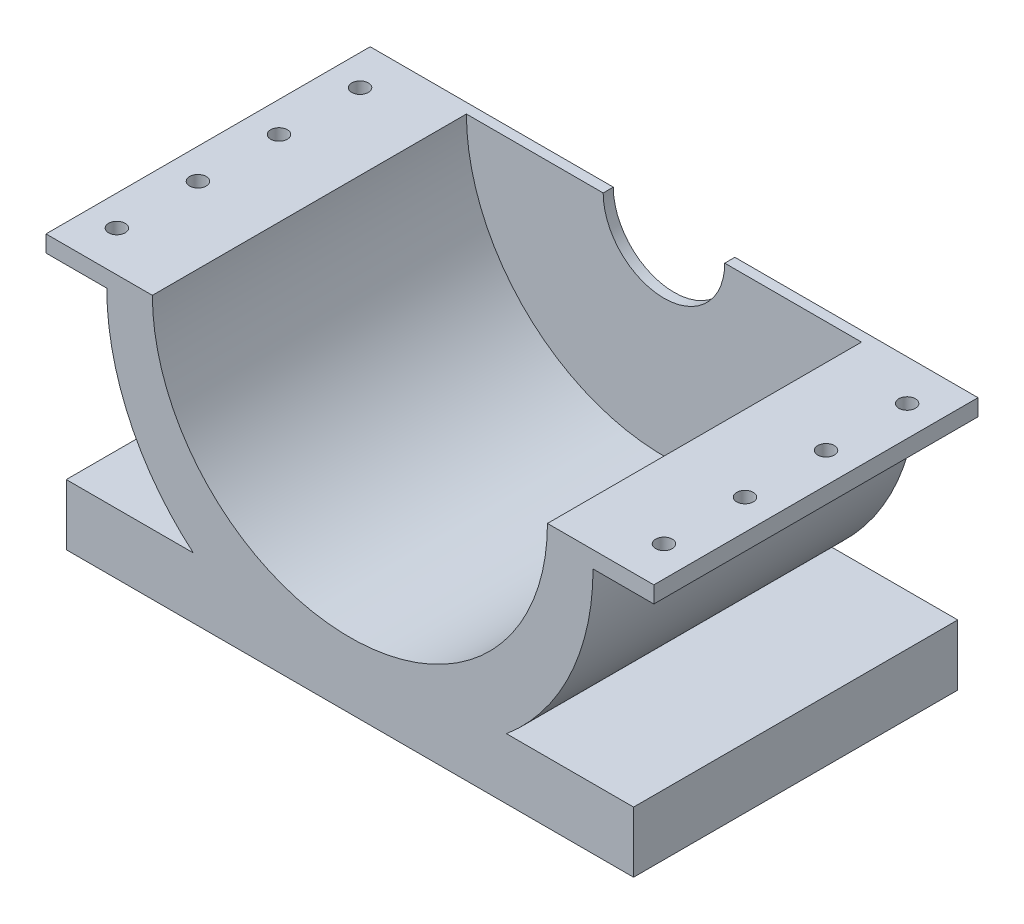
ISO-10303-21;
HEADER;
FILE_DESCRIPTION(('STEP AP214'),'2;1');
FILE_NAME('part.step','',(''),(''),'','','');
FILE_SCHEMA(('AUTOMOTIVE_DESIGN { 1 0 10303 214 1 1 1 1 }'));
ENDSEC;
DATA;
#1=APPLICATION_CONTEXT('core data for automotive mechanical design processes');
#2=APPLICATION_PROTOCOL_DEFINITION('international standard','automotive_design',2000,#1);
#3=PRODUCT_CONTEXT('',#1,'mechanical');
#4=PRODUCT('Part','Part','',(#3));
#5=PRODUCT_RELATED_PRODUCT_CATEGORY('part','',(#4));
#6=PRODUCT_DEFINITION_FORMATION('','',#4);
#7=PRODUCT_DEFINITION_CONTEXT('part definition',#1,'design');
#8=PRODUCT_DEFINITION('design','',#6,#7);
#9=PRODUCT_DEFINITION_SHAPE('','',#8);
#10=(LENGTH_UNIT() NAMED_UNIT(*) SI_UNIT(.MILLI.,.METRE.));
#11=(NAMED_UNIT(*) PLANE_ANGLE_UNIT() SI_UNIT($,.RADIAN.));
#12=(NAMED_UNIT(*) SI_UNIT($,.STERADIAN.) SOLID_ANGLE_UNIT());
#13=UNCERTAINTY_MEASURE_WITH_UNIT(LENGTH_MEASURE(1.E-05),#10,'distance_accuracy_value','');
#14=(GEOMETRIC_REPRESENTATION_CONTEXT(3) GLOBAL_UNCERTAINTY_ASSIGNED_CONTEXT((#13)) GLOBAL_UNIT_ASSIGNED_CONTEXT((#10,
#11,#12)) REPRESENTATION_CONTEXT('',''));
#15=CARTESIAN_POINT('',(0.,0.,0.));
#16=DIRECTION('',(0.,0.,1.));
#17=DIRECTION('',(1.,0.,0.));
#18=AXIS2_PLACEMENT_3D('',#15,#16,#17);
#19=CARTESIAN_POINT('',(7.5,0.41,4.));
#20=DIRECTION('',(0.,-1.,0.));
#21=DIRECTION('',(1.,0.,0.));
#22=AXIS2_PLACEMENT_3D('',#19,#20,#21);
#23=PLANE('',#22);
#24=CARTESIAN_POINT('',(-6.75,0.41,-1.));
#25=DIRECTION('',(0.,-1.,0.));
#26=DIRECTION('',(1.,0.,0.));
#27=AXIS2_PLACEMENT_3D('',#24,#25,#26);
#28=CIRCLE('',#27,0.205000000000001);
#29=CARTESIAN_POINT('',(-6.545,0.41,-1.));
#30=VERTEX_POINT('',#29);
#31=EDGE_CURVE('E233',#30,#30,#28,.T.);
#32=ORIENTED_EDGE('',*,*,#31,.T.);
#33=EDGE_LOOP('',(#32));
#34=FACE_BOUND('',#33,.T.);
#35=CARTESIAN_POINT('',(-6.75,0.41,1.));
#36=DIRECTION('',(0.,-1.,0.));
#37=DIRECTION('',(1.,0.,0.));
#38=AXIS2_PLACEMENT_3D('',#35,#36,#37);
#39=CIRCLE('',#38,0.205000000000001);
#40=CARTESIAN_POINT('',(-6.545,0.41,1.));
#41=VERTEX_POINT('',#40);
#42=EDGE_CURVE('E573',#41,#41,#39,.T.);
#43=ORIENTED_EDGE('',*,*,#42,.T.);
#44=EDGE_LOOP('',(#43));
#45=FACE_BOUND('',#44,.T.);
#46=CARTESIAN_POINT('',(-6.75,0.41,3.));
#47=DIRECTION('',(0.,-1.,0.));
#48=DIRECTION('',(1.,0.,0.));
#49=AXIS2_PLACEMENT_3D('',#46,#47,#48);
#50=CIRCLE('',#49,0.205000000000001);
#51=CARTESIAN_POINT('',(-6.545,0.41,3.));
#52=VERTEX_POINT('',#51);
#53=EDGE_CURVE('E246',#52,#52,#50,.T.);
#54=ORIENTED_EDGE('',*,*,#53,.T.);
#55=EDGE_LOOP('',(#54));
#56=FACE_BOUND('',#55,.T.);
#57=CARTESIAN_POINT('',(-6.75,0.41,-3.));
#58=DIRECTION('',(0.,-1.,0.));
#59=DIRECTION('',(1.,0.,0.));
#60=AXIS2_PLACEMENT_3D('',#57,#58,#59);
#61=CIRCLE('',#60,0.205000000000001);
#62=CARTESIAN_POINT('',(-6.545,0.41,-3.));
#63=VERTEX_POINT('',#62);
#64=EDGE_CURVE('E229',#63,#63,#61,.T.);
#65=ORIENTED_EDGE('',*,*,#64,.T.);
#66=EDGE_LOOP('',(#65));
#67=FACE_BOUND('',#66,.T.);
#68=DIRECTION('',(-1.,0.,0.));
#69=VECTOR('',#68,1.);
#70=CARTESIAN_POINT('',(-4.875,0.409999999999999,-3.75));
#71=LINE('',#70,#69);
#72=CARTESIAN_POINT('',(-1.5,0.409999999999999,-3.75));
#73=VERTEX_POINT('',#72);
#74=CARTESIAN_POINT('',(-4.875,0.409999999999999,-3.75));
#75=VERTEX_POINT('',#74);
#76=EDGE_CURVE('E161',#73,#75,#71,.T.);
#77=ORIENTED_EDGE('',*,*,#76,.F.);
#78=DIRECTION('',(0.,0.,-1.));
#79=VECTOR('',#78,1.);
#80=CARTESIAN_POINT('',(-1.5,0.409999999999999,3.75));
#81=LINE('',#80,#79);
#82=CARTESIAN_POINT('',(-1.5,0.409999999999999,-4.));
#83=VERTEX_POINT('',#82);
#84=EDGE_CURVE('E49',#73,#83,#81,.T.);
#85=ORIENTED_EDGE('',*,*,#84,.T.);
#86=DIRECTION('',(-1.,0.,0.));
#87=VECTOR('',#86,1.);
#88=CARTESIAN_POINT('',(7.5,0.41,-4.));
#89=LINE('',#88,#87);
#90=CARTESIAN_POINT('',(-7.5,0.409999999999998,-4.));
#91=VERTEX_POINT('',#90);
#92=EDGE_CURVE('E159',#83,#91,#89,.T.);
#93=ORIENTED_EDGE('',*,*,#92,.T.);
#94=DIRECTION('',(0.,0.,-1.));
#95=VECTOR('',#94,1.);
#96=CARTESIAN_POINT('',(-7.5,0.409999999999998,4.));
#97=LINE('',#96,#95);
#98=CARTESIAN_POINT('',(-7.5,0.409999999999998,4.));
#99=VERTEX_POINT('',#98);
#100=EDGE_CURVE('E215',#99,#91,#97,.T.);
#101=ORIENTED_EDGE('',*,*,#100,.F.);
#102=DIRECTION('',(-1.,0.,0.));
#103=VECTOR('',#102,1.);
#104=CARTESIAN_POINT('',(7.5,0.41,4.));
#105=LINE('',#104,#103);
#106=CARTESIAN_POINT('',(-4.875,0.409999999999998,4.));
#107=VERTEX_POINT('',#106);
#108=EDGE_CURVE('E290',#107,#99,#105,.T.);
#109=ORIENTED_EDGE('',*,*,#108,.F.);
#110=DIRECTION('',(0.,0.,1.));
#111=VECTOR('',#110,1.);
#112=CARTESIAN_POINT('',(-4.875,0.409999999999999,-3.75));
#113=LINE('',#112,#111);
#114=EDGE_CURVE('E57',#75,#107,#113,.T.);
#115=ORIENTED_EDGE('',*,*,#114,.F.);
#116=EDGE_LOOP('',(#77,#85,#93,#101,#109,#115));
#117=FACE_BOUND('',#116,.T.);
#118=ADVANCED_FACE('F33',(#34,#45,#56,#67,#117),#23,.F.);
#119=CARTESIAN_POINT('',(0.,0.,4.));
#120=DIRECTION('',(0.,0.,-1.));
#121=DIRECTION('',(-1.,0.,0.));
#122=AXIS2_PLACEMENT_3D('',#119,#120,#121);
#123=CYLINDRICAL_SURFACE('',#122,6.);
#124=CARTESIAN_POINT('',(0.,0.,-4.));
#125=DIRECTION('',(0.,0.,1.));
#126=DIRECTION('',(1.,0.,0.));
#127=AXIS2_PLACEMENT_3D('',#124,#125,#126);
#128=CIRCLE('',#127,6.);
#129=CARTESIAN_POINT('',(3.8641816727478,-4.59,-4.));
#130=VERTEX_POINT('',#129);
#131=CARTESIAN_POINT('',(6.,0.,-4.));
#132=VERTEX_POINT('',#131);
#133=EDGE_CURVE('E281',#130,#132,#128,.T.);
#134=ORIENTED_EDGE('',*,*,#133,.T.);
#135=DIRECTION('',(0.,0.,-1.));
#136=VECTOR('',#135,1.);
#137=CARTESIAN_POINT('',(6.,0.,4.));
#138=LINE('',#137,#136);
#139=CARTESIAN_POINT('',(6.,0.,4.));
#140=VERTEX_POINT('',#139);
#141=EDGE_CURVE('E42',#140,#132,#138,.T.);
#142=ORIENTED_EDGE('',*,*,#141,.F.);
#143=CARTESIAN_POINT('',(0.,0.,4.));
#144=DIRECTION('',(0.,0.,1.));
#145=DIRECTION('',(1.,0.,0.));
#146=AXIS2_PLACEMENT_3D('',#143,#144,#145);
#147=CIRCLE('',#146,6.);
#148=CARTESIAN_POINT('',(3.8641816727478,-4.59,4.));
#149=VERTEX_POINT('',#148);
#150=EDGE_CURVE('E189',#149,#140,#147,.T.);
#151=ORIENTED_EDGE('',*,*,#150,.F.);
#152=DIRECTION('',(0.,0.,-1.));
#153=VECTOR('',#152,1.);
#154=CARTESIAN_POINT('',(3.8641816727478,-4.59,4.));
#155=LINE('',#154,#153);
#156=EDGE_CURVE('E190',#149,#130,#155,.T.);
#157=ORIENTED_EDGE('',*,*,#156,.T.);
#158=EDGE_LOOP('',(#134,#142,#151,#157));
#159=FACE_BOUND('',#158,.T.);
#160=ADVANCED_FACE('F35',(#159),#123,.T.);
#161=CARTESIAN_POINT('',(7.5,0.,4.));
#162=DIRECTION('',(0.,1.,0.));
#163=DIRECTION('',(-1.,0.,0.));
#164=AXIS2_PLACEMENT_3D('',#161,#162,#163);
#165=PLANE('',#164);
#166=CARTESIAN_POINT('',(6.75,0.,-1.));
#167=DIRECTION('',(0.,1.,0.));
#168=DIRECTION('',(-1.,0.,0.));
#169=AXIS2_PLACEMENT_3D('',#166,#167,#168);
#170=CIRCLE('',#169,0.205000000000001);
#171=CARTESIAN_POINT('',(6.545,0.,-1.));
#172=VERTEX_POINT('',#171);
#173=EDGE_CURVE('E262',#172,#172,#170,.T.);
#174=ORIENTED_EDGE('',*,*,#173,.T.);
#175=EDGE_LOOP('',(#174));
#176=FACE_BOUND('',#175,.T.);
#177=CARTESIAN_POINT('',(6.75,0.,1.));
#178=DIRECTION('',(0.,1.,0.));
#179=DIRECTION('',(-1.,0.,0.));
#180=AXIS2_PLACEMENT_3D('',#177,#178,#179);
#181=CIRCLE('',#180,0.205000000000001);
#182=CARTESIAN_POINT('',(6.545,0.,1.));
#183=VERTEX_POINT('',#182);
#184=EDGE_CURVE('E259',#183,#183,#181,.T.);
#185=ORIENTED_EDGE('',*,*,#184,.T.);
#186=EDGE_LOOP('',(#185));
#187=FACE_BOUND('',#186,.T.);
#188=CARTESIAN_POINT('',(6.75,0.,3.));
#189=DIRECTION('',(0.,1.,0.));
#190=DIRECTION('',(-1.,0.,0.));
#191=AXIS2_PLACEMENT_3D('',#188,#189,#190);
#192=CIRCLE('',#191,0.205000000000001);
#193=CARTESIAN_POINT('',(6.545,0.,3.));
#194=VERTEX_POINT('',#193);
#195=EDGE_CURVE('E251',#194,#194,#192,.T.);
#196=ORIENTED_EDGE('',*,*,#195,.T.);
#197=EDGE_LOOP('',(#196));
#198=FACE_BOUND('',#197,.T.);
#199=CARTESIAN_POINT('',(6.75,0.,-3.));
#200=DIRECTION('',(0.,1.,0.));
#201=DIRECTION('',(-1.,0.,0.));
#202=AXIS2_PLACEMENT_3D('',#199,#200,#201);
#203=CIRCLE('',#202,0.205000000000001);
#204=CARTESIAN_POINT('',(6.545,0.,-3.));
#205=VERTEX_POINT('',#204);
#206=EDGE_CURVE('E154',#205,#205,#203,.T.);
#207=ORIENTED_EDGE('',*,*,#206,.T.);
#208=EDGE_LOOP('',(#207));
#209=FACE_BOUND('',#208,.T.);
#210=DIRECTION('',(1.,0.,0.));
#211=VECTOR('',#210,1.);
#212=CARTESIAN_POINT('',(7.5,0.,-4.));
#213=LINE('',#212,#211);
#214=CARTESIAN_POINT('',(7.5,0.,-4.));
#215=VERTEX_POINT('',#214);
#216=EDGE_CURVE('E170',#132,#215,#213,.T.);
#217=ORIENTED_EDGE('',*,*,#216,.T.);
#218=DIRECTION('',(0.,0.,-1.));
#219=VECTOR('',#218,1.);
#220=CARTESIAN_POINT('',(7.5,0.,4.));
#221=LINE('',#220,#219);
#222=CARTESIAN_POINT('',(7.5,0.,4.));
#223=VERTEX_POINT('',#222);
#224=EDGE_CURVE('E220',#223,#215,#221,.T.);
#225=ORIENTED_EDGE('',*,*,#224,.F.);
#226=DIRECTION('',(1.,0.,0.));
#227=VECTOR('',#226,1.);
#228=CARTESIAN_POINT('',(7.5,0.,4.));
#229=LINE('',#228,#227);
#230=EDGE_CURVE('E286',#140,#223,#229,.T.);
#231=ORIENTED_EDGE('',*,*,#230,.F.);
#232=ORIENTED_EDGE('',*,*,#141,.T.);
#233=EDGE_LOOP('',(#217,#225,#231,#232));
#234=FACE_BOUND('',#233,.T.);
#235=ADVANCED_FACE('F312',(#176,#187,#198,#209,#234),#165,.F.);
#236=CARTESIAN_POINT('',(7.5,0.41,4.));
#237=DIRECTION('',(-1.,0.,0.));
#238=DIRECTION('',(0.,0.,1.));
#239=AXIS2_PLACEMENT_3D('',#236,#237,#238);
#240=PLANE('',#239);
#241=DIRECTION('',(0.,1.,0.));
#242=VECTOR('',#241,1.);
#243=CARTESIAN_POINT('',(7.5,0.41,-4.));
#244=LINE('',#243,#242);
#245=CARTESIAN_POINT('',(7.5,0.41,-4.));
#246=VERTEX_POINT('',#245);
#247=EDGE_CURVE('E168',#215,#246,#244,.T.);
#248=ORIENTED_EDGE('',*,*,#247,.T.);
#249=DIRECTION('',(0.,0.,-1.));
#250=VECTOR('',#249,1.);
#251=CARTESIAN_POINT('',(7.5,0.41,4.));
#252=LINE('',#251,#250);
#253=CARTESIAN_POINT('',(7.5,0.41,4.));
#254=VERTEX_POINT('',#253);
#255=EDGE_CURVE('E217',#254,#246,#252,.T.);
#256=ORIENTED_EDGE('',*,*,#255,.F.);
#257=DIRECTION('',(0.,1.,0.));
#258=VECTOR('',#257,1.);
#259=CARTESIAN_POINT('',(7.5,0.41,4.));
#260=LINE('',#259,#258);
#261=EDGE_CURVE('E288',#223,#254,#260,.T.);
#262=ORIENTED_EDGE('',*,*,#261,.F.);
#263=ORIENTED_EDGE('',*,*,#224,.T.);
#264=EDGE_LOOP('',(#248,#256,#262,#263));
#265=FACE_BOUND('',#264,.T.);
#266=ADVANCED_FACE('F318',(#265),#240,.F.);
#267=CARTESIAN_POINT('',(6.75,0.41,-1.));
#268=DIRECTION('',(0.,1.,0.));
#269=DIRECTION('',(-1.,0.,0.));
#270=AXIS2_PLACEMENT_3D('',#267,#268,#269);
#271=CIRCLE('',#270,0.205000000000001);
#272=CARTESIAN_POINT('',(6.545,0.41,-1.));
#273=VERTEX_POINT('',#272);
#274=EDGE_CURVE('E248',#273,#273,#271,.T.);
#275=ORIENTED_EDGE('',*,*,#274,.F.);
#276=EDGE_LOOP('',(#275));
#277=FACE_BOUND('',#276,.T.);
#278=CARTESIAN_POINT('',(6.75,0.41,1.));
#279=DIRECTION('',(0.,1.,0.));
#280=DIRECTION('',(-1.,0.,0.));
#281=AXIS2_PLACEMENT_3D('',#278,#279,#280);
#282=CIRCLE('',#281,0.205000000000001);
#283=CARTESIAN_POINT('',(6.545,0.41,1.));
#284=VERTEX_POINT('',#283);
#285=EDGE_CURVE('E252',#284,#284,#282,.T.);
#286=ORIENTED_EDGE('',*,*,#285,.F.);
#287=EDGE_LOOP('',(#286));
#288=FACE_BOUND('',#287,.T.);
#289=CARTESIAN_POINT('',(6.75,0.41,3.));
#290=DIRECTION('',(0.,1.,0.));
#291=DIRECTION('',(-1.,0.,0.));
#292=AXIS2_PLACEMENT_3D('',#289,#290,#291);
#293=CIRCLE('',#292,0.205000000000001);
#294=CARTESIAN_POINT('',(6.545,0.41,3.));
#295=VERTEX_POINT('',#294);
#296=EDGE_CURVE('E228',#295,#295,#293,.T.);
#297=ORIENTED_EDGE('',*,*,#296,.F.);
#298=EDGE_LOOP('',(#297));
#299=FACE_BOUND('',#298,.T.);
#300=CARTESIAN_POINT('',(6.75,0.41,-3.));
#301=DIRECTION('',(0.,1.,0.));
#302=DIRECTION('',(-1.,0.,0.));
#303=AXIS2_PLACEMENT_3D('',#300,#301,#302);
#304=CIRCLE('',#303,0.205000000000001);
#305=CARTESIAN_POINT('',(6.545,0.41,-3.));
#306=VERTEX_POINT('',#305);
#307=EDGE_CURVE('E265',#306,#306,#304,.T.);
#308=ORIENTED_EDGE('',*,*,#307,.F.);
#309=EDGE_LOOP('',(#308));
#310=FACE_BOUND('',#309,.T.);
#311=CARTESIAN_POINT('',(1.5,0.409999999999999,-4.));
#312=VERTEX_POINT('',#311);
#313=EDGE_CURVE('E167',#246,#312,#89,.T.);
#314=ORIENTED_EDGE('',*,*,#313,.T.);
#315=DIRECTION('',(0.,0.,-1.));
#316=VECTOR('',#315,1.);
#317=CARTESIAN_POINT('',(1.5,0.409999999999999,3.75));
#318=LINE('',#317,#316);
#319=CARTESIAN_POINT('',(1.5,0.409999999999999,-3.75));
#320=VERTEX_POINT('',#319);
#321=EDGE_CURVE('E149',#320,#312,#318,.T.);
#322=ORIENTED_EDGE('',*,*,#321,.F.);
#323=CARTESIAN_POINT('',(4.875,0.409999999999999,-3.75));
#324=VERTEX_POINT('',#323);
#325=EDGE_CURVE('E275',#324,#320,#71,.T.);
#326=ORIENTED_EDGE('',*,*,#325,.F.);
#327=DIRECTION('',(0.,0.,1.));
#328=VECTOR('',#327,1.);
#329=CARTESIAN_POINT('',(4.875,0.409999999999999,-3.75));
#330=LINE('',#329,#328);
#331=CARTESIAN_POINT('',(4.875,0.409999999999999,4.));
#332=VERTEX_POINT('',#331);
#333=EDGE_CURVE('E278',#324,#332,#330,.T.);
#334=ORIENTED_EDGE('',*,*,#333,.T.);
#335=EDGE_CURVE('E291',#254,#332,#105,.T.);
#336=ORIENTED_EDGE('',*,*,#335,.F.);
#337=ORIENTED_EDGE('',*,*,#255,.T.);
#338=EDGE_LOOP('',(#314,#322,#326,#334,#336,#337));
#339=FACE_BOUND('',#338,.T.);
#340=ADVANCED_FACE('F321',(#277,#288,#299,#310,#339),#23,.F.);
#341=CARTESIAN_POINT('',(-7.5,0.409999999999998,4.));
#342=DIRECTION('',(1.,0.,0.));
#343=DIRECTION('',(0.,1.,0.));
#344=AXIS2_PLACEMENT_3D('',#341,#342,#343);
#345=PLANE('',#344);
#346=DIRECTION('',(0.,-1.,0.));
#347=VECTOR('',#346,1.);
#348=CARTESIAN_POINT('',(-7.5,0.409999999999998,-4.));
#349=LINE('',#348,#347);
#350=CARTESIAN_POINT('',(-7.5,0.,-4.));
#351=VERTEX_POINT('',#350);
#352=EDGE_CURVE('E166',#91,#351,#349,.T.);
#353=ORIENTED_EDGE('',*,*,#352,.T.);
#354=DIRECTION('',(0.,0.,-1.));
#355=VECTOR('',#354,1.);
#356=CARTESIAN_POINT('',(-7.5,0.,4.));
#357=LINE('',#356,#355);
#358=CARTESIAN_POINT('',(-7.5,0.,4.));
#359=VERTEX_POINT('',#358);
#360=EDGE_CURVE('E212',#359,#351,#357,.T.);
#361=ORIENTED_EDGE('',*,*,#360,.F.);
#362=DIRECTION('',(0.,-1.,0.));
#363=VECTOR('',#362,1.);
#364=CARTESIAN_POINT('',(-7.5,0.409999999999998,4.));
#365=LINE('',#364,#363);
#366=EDGE_CURVE('E294',#99,#359,#365,.T.);
#367=ORIENTED_EDGE('',*,*,#366,.F.);
#368=ORIENTED_EDGE('',*,*,#100,.T.);
#369=EDGE_LOOP('',(#353,#361,#367,#368));
#370=FACE_BOUND('',#369,.T.);
#371=ADVANCED_FACE('F366',(#370),#345,.F.);
#372=CARTESIAN_POINT('',(-6.,0.,4.));
#373=DIRECTION('',(0.,1.,0.));
#374=DIRECTION('',(-1.,0.,0.));
#375=AXIS2_PLACEMENT_3D('',#372,#373,#374);
#376=PLANE('',#375);
#377=CARTESIAN_POINT('',(-6.75,0.,-1.));
#378=DIRECTION('',(0.,1.,0.));
#379=DIRECTION('',(-1.,0.,0.));
#380=AXIS2_PLACEMENT_3D('',#377,#378,#379);
#381=CIRCLE('',#380,0.205000000000001);
#382=CARTESIAN_POINT('',(-6.955,0.,-1.));
#383=VERTEX_POINT('',#382);
#384=EDGE_CURVE('E37',#383,#383,#381,.F.);
#385=ORIENTED_EDGE('',*,*,#384,.F.);
#386=EDGE_LOOP('',(#385));
#387=FACE_BOUND('',#386,.T.);
#388=CARTESIAN_POINT('',(-6.75,0.,1.));
#389=DIRECTION('',(0.,1.,0.));
#390=DIRECTION('',(-1.,0.,0.));
#391=AXIS2_PLACEMENT_3D('',#388,#389,#390);
#392=CIRCLE('',#391,0.205000000000001);
#393=CARTESIAN_POINT('',(-6.955,0.,1.));
#394=VERTEX_POINT('',#393);
#395=EDGE_CURVE('E232',#394,#394,#392,.F.);
#396=ORIENTED_EDGE('',*,*,#395,.F.);
#397=EDGE_LOOP('',(#396));
#398=FACE_BOUND('',#397,.T.);
#399=CARTESIAN_POINT('',(-6.75,0.,3.));
#400=DIRECTION('',(0.,1.,0.));
#401=DIRECTION('',(-1.,0.,0.));
#402=AXIS2_PLACEMENT_3D('',#399,#400,#401);
#403=CIRCLE('',#402,0.205000000000001);
#404=CARTESIAN_POINT('',(-6.955,0.,3.));
#405=VERTEX_POINT('',#404);
#406=EDGE_CURVE('E230',#405,#405,#403,.F.);
#407=ORIENTED_EDGE('',*,*,#406,.F.);
#408=EDGE_LOOP('',(#407));
#409=FACE_BOUND('',#408,.T.);
#410=CARTESIAN_POINT('',(-6.75,0.,-3.));
#411=DIRECTION('',(0.,1.,0.));
#412=DIRECTION('',(-1.,0.,0.));
#413=AXIS2_PLACEMENT_3D('',#410,#411,#412);
#414=CIRCLE('',#413,0.205000000000001);
#415=CARTESIAN_POINT('',(-6.955,0.,-3.));
#416=VERTEX_POINT('',#415);
#417=EDGE_CURVE('E225',#416,#416,#414,.F.);
#418=ORIENTED_EDGE('',*,*,#417,.F.);
#419=EDGE_LOOP('',(#418));
#420=FACE_BOUND('',#419,.T.);
#421=DIRECTION('',(1.,0.,0.));
#422=VECTOR('',#421,1.);
#423=CARTESIAN_POINT('',(-6.,0.,-4.));
#424=LINE('',#423,#422);
#425=CARTESIAN_POINT('',(-6.,0.,-4.));
#426=VERTEX_POINT('',#425);
#427=EDGE_CURVE('E175',#351,#426,#424,.T.);
#428=ORIENTED_EDGE('',*,*,#427,.T.);
#429=DIRECTION('',(0.,0.,-1.));
#430=VECTOR('',#429,1.);
#431=CARTESIAN_POINT('',(-6.,0.,4.));
#432=LINE('',#431,#430);
#433=CARTESIAN_POINT('',(-6.,0.,4.));
#434=VERTEX_POINT('',#433);
#435=EDGE_CURVE('E209',#434,#426,#432,.T.);
#436=ORIENTED_EDGE('',*,*,#435,.F.);
#437=DIRECTION('',(1.,0.,0.));
#438=VECTOR('',#437,1.);
#439=CARTESIAN_POINT('',(-6.,0.,4.));
#440=LINE('',#439,#438);
#441=EDGE_CURVE('E296',#359,#434,#440,.T.);
#442=ORIENTED_EDGE('',*,*,#441,.F.);
#443=ORIENTED_EDGE('',*,*,#360,.T.);
#444=EDGE_LOOP('',(#428,#436,#442,#443));
#445=FACE_BOUND('',#444,.T.);
#446=ADVANCED_FACE('F361',(#387,#398,#409,#420,#445),#376,.F.);
#447=CARTESIAN_POINT('',(0.,0.,4.));
#448=DIRECTION('',(0.,0.,-1.));
#449=DIRECTION('',(-1.,0.,0.));
#450=AXIS2_PLACEMENT_3D('',#447,#448,#449);
#451=CYLINDRICAL_SURFACE('',#450,6.);
#452=CARTESIAN_POINT('',(0.,0.,-4.));
#453=DIRECTION('',(0.,0.,1.));
#454=DIRECTION('',(1.,0.,0.));
#455=AXIS2_PLACEMENT_3D('',#452,#453,#454);
#456=CIRCLE('',#455,6.);
#457=CARTESIAN_POINT('',(-3.86418167274781,-4.59,-4.));
#458=VERTEX_POINT('',#457);
#459=EDGE_CURVE('E177',#426,#458,#456,.T.);
#460=ORIENTED_EDGE('',*,*,#459,.T.);
#461=DIRECTION('',(0.,0.,-1.));
#462=VECTOR('',#461,1.);
#463=CARTESIAN_POINT('',(-3.86418167274781,-4.59,4.));
#464=LINE('',#463,#462);
#465=CARTESIAN_POINT('',(-3.86418167274781,-4.59,4.));
#466=VERTEX_POINT('',#465);
#467=EDGE_CURVE('E206',#466,#458,#464,.T.);
#468=ORIENTED_EDGE('',*,*,#467,.F.);
#469=CARTESIAN_POINT('',(0.,0.,4.));
#470=DIRECTION('',(0.,0.,1.));
#471=DIRECTION('',(1.,0.,0.));
#472=AXIS2_PLACEMENT_3D('',#469,#470,#471);
#473=CIRCLE('',#472,6.);
#474=EDGE_CURVE('E298',#434,#466,#473,.T.);
#475=ORIENTED_EDGE('',*,*,#474,.F.);
#476=ORIENTED_EDGE('',*,*,#435,.T.);
#477=EDGE_LOOP('',(#460,#468,#475,#476));
#478=FACE_BOUND('',#477,.T.);
#479=ADVANCED_FACE('F358',(#478),#451,.T.);
#480=CARTESIAN_POINT('',(-7.,-4.59,4.));
#481=DIRECTION('',(0.,-1.,0.));
#482=DIRECTION('',(1.,0.,0.));
#483=AXIS2_PLACEMENT_3D('',#480,#481,#482);
#484=PLANE('',#483);
#485=DIRECTION('',(-1.,0.,0.));
#486=VECTOR('',#485,1.);
#487=CARTESIAN_POINT('',(-7.,-4.59,-4.));
#488=LINE('',#487,#486);
#489=CARTESIAN_POINT('',(-7.,-4.59,-4.));
#490=VERTEX_POINT('',#489);
#491=EDGE_CURVE('E179',#458,#490,#488,.T.);
#492=ORIENTED_EDGE('',*,*,#491,.T.);
#493=DIRECTION('',(0.,0.,-1.));
#494=VECTOR('',#493,1.);
#495=CARTESIAN_POINT('',(-7.,-4.59,4.));
#496=LINE('',#495,#494);
#497=CARTESIAN_POINT('',(-7.,-4.59,4.));
#498=VERTEX_POINT('',#497);
#499=EDGE_CURVE('E203',#498,#490,#496,.T.);
#500=ORIENTED_EDGE('',*,*,#499,.F.);
#501=DIRECTION('',(-1.,0.,0.));
#502=VECTOR('',#501,1.);
#503=CARTESIAN_POINT('',(-7.,-4.59,4.));
#504=LINE('',#503,#502);
#505=EDGE_CURVE('E300',#466,#498,#504,.T.);
#506=ORIENTED_EDGE('',*,*,#505,.F.);
#507=ORIENTED_EDGE('',*,*,#467,.T.);
#508=EDGE_LOOP('',(#492,#500,#506,#507));
#509=FACE_BOUND('',#508,.T.);
#510=ADVANCED_FACE('F354',(#509),#484,.F.);
#511=CARTESIAN_POINT('',(-7.,-4.59,4.));
#512=DIRECTION('',(1.,0.,0.));
#513=DIRECTION('',(0.,0.,-1.));
#514=AXIS2_PLACEMENT_3D('',#511,#512,#513);
#515=PLANE('',#514);
#516=DIRECTION('',(0.,-1.,0.));
#517=VECTOR('',#516,1.);
#518=CARTESIAN_POINT('',(-7.,-4.59,-4.));
#519=LINE('',#518,#517);
#520=CARTESIAN_POINT('',(-7.,-6.09,-4.));
#521=VERTEX_POINT('',#520);
#522=EDGE_CURVE('E181',#490,#521,#519,.T.);
#523=ORIENTED_EDGE('',*,*,#522,.T.);
#524=DIRECTION('',(0.,0.,-1.));
#525=VECTOR('',#524,1.);
#526=CARTESIAN_POINT('',(-7.,-6.09,4.));
#527=LINE('',#526,#525);
#528=CARTESIAN_POINT('',(-7.,-6.09,4.));
#529=VERTEX_POINT('',#528);
#530=EDGE_CURVE('E200',#529,#521,#527,.T.);
#531=ORIENTED_EDGE('',*,*,#530,.F.);
#532=DIRECTION('',(0.,-1.,0.));
#533=VECTOR('',#532,1.);
#534=CARTESIAN_POINT('',(-7.,-4.59,4.));
#535=LINE('',#534,#533);
#536=EDGE_CURVE('E302',#498,#529,#535,.T.);
#537=ORIENTED_EDGE('',*,*,#536,.F.);
#538=ORIENTED_EDGE('',*,*,#499,.T.);
#539=EDGE_LOOP('',(#523,#531,#537,#538));
#540=FACE_BOUND('',#539,.T.);
#541=ADVANCED_FACE('F349',(#540),#515,.F.);
#542=CARTESIAN_POINT('',(-7.,-6.09,4.));
#543=DIRECTION('',(0.,1.,0.));
#544=DIRECTION('',(0.,0.,1.));
#545=AXIS2_PLACEMENT_3D('',#542,#543,#544);
#546=PLANE('',#545);
#547=DIRECTION('',(1.,0.,0.));
#548=VECTOR('',#547,1.);
#549=CARTESIAN_POINT('',(-7.,-6.09,-4.));
#550=LINE('',#549,#548);
#551=CARTESIAN_POINT('',(7.,-6.09,-4.));
#552=VERTEX_POINT('',#551);
#553=EDGE_CURVE('E183',#521,#552,#550,.T.);
#554=ORIENTED_EDGE('',*,*,#553,.T.);
#555=DIRECTION('',(0.,0.,-1.));
#556=VECTOR('',#555,1.);
#557=CARTESIAN_POINT('',(7.,-6.09,4.));
#558=LINE('',#557,#556);
#559=CARTESIAN_POINT('',(7.,-6.09,4.));
#560=VERTEX_POINT('',#559);
#561=EDGE_CURVE('E197',#560,#552,#558,.T.);
#562=ORIENTED_EDGE('',*,*,#561,.F.);
#563=DIRECTION('',(1.,0.,0.));
#564=VECTOR('',#563,1.);
#565=CARTESIAN_POINT('',(-7.,-6.09,4.));
#566=LINE('',#565,#564);
#567=EDGE_CURVE('E304',#529,#560,#566,.T.);
#568=ORIENTED_EDGE('',*,*,#567,.F.);
#569=ORIENTED_EDGE('',*,*,#530,.T.);
#570=EDGE_LOOP('',(#554,#562,#568,#569));
#571=FACE_BOUND('',#570,.T.);
#572=ADVANCED_FACE('F343',(#571),#546,.F.);
#573=CARTESIAN_POINT('',(7.,-4.59,4.));
#574=DIRECTION('',(-1.,0.,0.));
#575=DIRECTION('',(0.,-1.,0.));
#576=AXIS2_PLACEMENT_3D('',#573,#574,#575);
#577=PLANE('',#576);
#578=DIRECTION('',(0.,1.,0.));
#579=VECTOR('',#578,1.);
#580=CARTESIAN_POINT('',(7.,-4.59,-4.));
#581=LINE('',#580,#579);
#582=CARTESIAN_POINT('',(7.,-4.59,-4.));
#583=VERTEX_POINT('',#582);
#584=EDGE_CURVE('E185',#552,#583,#581,.T.);
#585=ORIENTED_EDGE('',*,*,#584,.T.);
#586=DIRECTION('',(0.,0.,-1.));
#587=VECTOR('',#586,1.);
#588=CARTESIAN_POINT('',(7.,-4.59,4.));
#589=LINE('',#588,#587);
#590=CARTESIAN_POINT('',(7.,-4.59,4.));
#591=VERTEX_POINT('',#590);
#592=EDGE_CURVE('E193',#591,#583,#589,.T.);
#593=ORIENTED_EDGE('',*,*,#592,.F.);
#594=DIRECTION('',(0.,1.,0.));
#595=VECTOR('',#594,1.);
#596=CARTESIAN_POINT('',(7.,-4.59,4.));
#597=LINE('',#596,#595);
#598=EDGE_CURVE('E306',#560,#591,#597,.T.);
#599=ORIENTED_EDGE('',*,*,#598,.F.);
#600=ORIENTED_EDGE('',*,*,#561,.T.);
#601=EDGE_LOOP('',(#585,#593,#599,#600));
#602=FACE_BOUND('',#601,.T.);
#603=ADVANCED_FACE('F339',(#602),#577,.F.);
#604=CARTESIAN_POINT('',(3.8641816727478,-4.59,4.));
#605=DIRECTION('',(0.,-1.,0.));
#606=DIRECTION('',(1.,0.,0.));
#607=AXIS2_PLACEMENT_3D('',#604,#605,#606);
#608=PLANE('',#607);
#609=DIRECTION('',(-1.,0.,0.));
#610=VECTOR('',#609,1.);
#611=CARTESIAN_POINT('',(3.8641816727478,-4.59,-4.));
#612=LINE('',#611,#610);
#613=EDGE_CURVE('E187',#583,#130,#612,.T.);
#614=ORIENTED_EDGE('',*,*,#613,.T.);
#615=ORIENTED_EDGE('',*,*,#156,.F.);
#616=DIRECTION('',(-1.,0.,0.));
#617=VECTOR('',#616,1.);
#618=CARTESIAN_POINT('',(3.8641816727478,-4.59,4.));
#619=LINE('',#618,#617);
#620=EDGE_CURVE('E194',#591,#149,#619,.T.);
#621=ORIENTED_EDGE('',*,*,#620,.F.);
#622=ORIENTED_EDGE('',*,*,#592,.T.);
#623=EDGE_LOOP('',(#614,#615,#621,#622));
#624=FACE_BOUND('',#623,.T.);
#625=ADVANCED_FACE('F335',(#624),#608,.F.);
#626=CARTESIAN_POINT('',(0.,0.,4.));
#627=DIRECTION('',(0.,0.,1.));
#628=DIRECTION('',(1.,0.,0.));
#629=AXIS2_PLACEMENT_3D('',#626,#627,#628);
#630=PLANE('',#629);
#631=CARTESIAN_POINT('',(0.,0.409999999999999,4.));
#632=DIRECTION('',(0.,0.,1.));
#633=DIRECTION('',(1.,0.,0.));
#634=AXIS2_PLACEMENT_3D('',#631,#632,#633);
#635=CIRCLE('',#634,4.875);
#636=EDGE_CURVE('E270',#107,#332,#635,.T.);
#637=ORIENTED_EDGE('',*,*,#636,.F.);
#638=ORIENTED_EDGE('',*,*,#108,.T.);
#639=ORIENTED_EDGE('',*,*,#366,.T.);
#640=ORIENTED_EDGE('',*,*,#441,.T.);
#641=ORIENTED_EDGE('',*,*,#474,.T.);
#642=ORIENTED_EDGE('',*,*,#505,.T.);
#643=ORIENTED_EDGE('',*,*,#536,.T.);
#644=ORIENTED_EDGE('',*,*,#567,.T.);
#645=ORIENTED_EDGE('',*,*,#598,.T.);
#646=ORIENTED_EDGE('',*,*,#620,.T.);
#647=ORIENTED_EDGE('',*,*,#150,.T.);
#648=ORIENTED_EDGE('',*,*,#230,.T.);
#649=ORIENTED_EDGE('',*,*,#261,.T.);
#650=ORIENTED_EDGE('',*,*,#335,.T.);
#651=EDGE_LOOP('',(#637,#638,#639,#640,#641,#642,#643,#644,#645,#646,#647,#648,#649,#650));
#652=FACE_BOUND('',#651,.T.);
#653=ADVANCED_FACE('F325',(#652),#630,.T.);
#654=CARTESIAN_POINT('',(0.,0.,-4.));
#655=DIRECTION('',(0.,0.,1.));
#656=DIRECTION('',(1.,0.,0.));
#657=AXIS2_PLACEMENT_3D('',#654,#655,#656);
#658=PLANE('',#657);
#659=ORIENTED_EDGE('',*,*,#92,.F.);
#660=CARTESIAN_POINT('',(0.,0.409999999999999,-4.));
#661=DIRECTION('',(0.,0.,-1.));
#662=DIRECTION('',(-1.,0.,0.));
#663=AXIS2_PLACEMENT_3D('',#660,#661,#662);
#664=CIRCLE('',#663,1.5);
#665=EDGE_CURVE('E146',#312,#83,#664,.T.);
#666=ORIENTED_EDGE('',*,*,#665,.F.);
#667=ORIENTED_EDGE('',*,*,#313,.F.);
#668=ORIENTED_EDGE('',*,*,#247,.F.);
#669=ORIENTED_EDGE('',*,*,#216,.F.);
#670=ORIENTED_EDGE('',*,*,#133,.F.);
#671=ORIENTED_EDGE('',*,*,#613,.F.);
#672=ORIENTED_EDGE('',*,*,#584,.F.);
#673=ORIENTED_EDGE('',*,*,#553,.F.);
#674=ORIENTED_EDGE('',*,*,#522,.F.);
#675=ORIENTED_EDGE('',*,*,#491,.F.);
#676=ORIENTED_EDGE('',*,*,#459,.F.);
#677=ORIENTED_EDGE('',*,*,#427,.F.);
#678=ORIENTED_EDGE('',*,*,#352,.F.);
#679=EDGE_LOOP('',(#659,#666,#667,#668,#669,#670,#671,#672,#673,#674,#675,#676,#677,#678));
#680=FACE_BOUND('',#679,.T.);
#681=ADVANCED_FACE('F164',(#680),#658,.F.);
#682=CARTESIAN_POINT('',(0.,0.409999999999999,-3.75));
#683=DIRECTION('',(0.,0.,1.));
#684=DIRECTION('',(1.,0.,0.));
#685=AXIS2_PLACEMENT_3D('',#682,#683,#684);
#686=CYLINDRICAL_SURFACE('',#685,4.875);
#687=ORIENTED_EDGE('',*,*,#636,.T.);
#688=ORIENTED_EDGE('',*,*,#333,.F.);
#689=CARTESIAN_POINT('',(0.,0.409999999999999,-3.75));
#690=DIRECTION('',(0.,0.,1.));
#691=DIRECTION('',(1.,0.,0.));
#692=AXIS2_PLACEMENT_3D('',#689,#690,#691);
#693=CIRCLE('',#692,4.875);
#694=EDGE_CURVE('E272',#75,#324,#693,.T.);
#695=ORIENTED_EDGE('',*,*,#694,.F.);
#696=ORIENTED_EDGE('',*,*,#114,.T.);
#697=EDGE_LOOP('',(#687,#688,#695,#696));
#698=FACE_BOUND('',#697,.T.);
#699=ADVANCED_FACE('F416',(#698),#686,.F.);
#700=CARTESIAN_POINT('',(0.,0.409999999999999,-3.75));
#701=DIRECTION('',(0.,0.,1.));
#702=DIRECTION('',(1.,0.,0.));
#703=AXIS2_PLACEMENT_3D('',#700,#701,#702);
#704=PLANE('',#703);
#705=CARTESIAN_POINT('',(0.,0.409999999999999,-3.75));
#706=DIRECTION('',(0.,0.,1.));
#707=DIRECTION('',(1.,0.,0.));
#708=AXIS2_PLACEMENT_3D('',#705,#706,#707);
#709=CIRCLE('',#708,1.5);
#710=EDGE_CURVE('E11',#73,#320,#709,.T.);
#711=ORIENTED_EDGE('',*,*,#710,.F.);
#712=ORIENTED_EDGE('',*,*,#76,.T.);
#713=ORIENTED_EDGE('',*,*,#694,.T.);
#714=ORIENTED_EDGE('',*,*,#325,.T.);
#715=EDGE_LOOP('',(#711,#712,#713,#714));
#716=FACE_BOUND('',#715,.T.);
#717=ADVANCED_FACE('F410',(#716),#704,.T.);
#718=CARTESIAN_POINT('',(0.,0.409999999999999,3.75));
#719=DIRECTION('',(0.,0.,-1.));
#720=DIRECTION('',(-1.,0.,0.));
#721=AXIS2_PLACEMENT_3D('',#718,#719,#720);
#722=CYLINDRICAL_SURFACE('',#721,1.5);
#723=ORIENTED_EDGE('',*,*,#710,.T.);
#724=ORIENTED_EDGE('',*,*,#321,.T.);
#725=ORIENTED_EDGE('',*,*,#665,.T.);
#726=ORIENTED_EDGE('',*,*,#84,.F.);
#727=EDGE_LOOP('',(#723,#724,#725,#726));
#728=FACE_BOUND('',#727,.T.);
#729=ADVANCED_FACE('F147',(#728),#722,.F.);
#730=CARTESIAN_POINT('',(6.75,-2.34,-3.));
#731=DIRECTION('',(0.,1.,0.));
#732=DIRECTION('',(-1.,0.,0.));
#733=AXIS2_PLACEMENT_3D('',#730,#731,#732);
#734=CYLINDRICAL_SURFACE('',#733,0.205000000000001);
#735=ORIENTED_EDGE('',*,*,#307,.T.);
#736=EDGE_LOOP('',(#735));
#737=FACE_BOUND('',#736,.T.);
#738=ORIENTED_EDGE('',*,*,#206,.F.);
#739=EDGE_LOOP('',(#738));
#740=FACE_BOUND('',#739,.T.);
#741=ADVANCED_FACE('F398',(#737,#740),#734,.F.);
#742=CARTESIAN_POINT('',(6.75,-2.34,3.));
#743=DIRECTION('',(0.,1.,0.));
#744=DIRECTION('',(-1.,0.,0.));
#745=AXIS2_PLACEMENT_3D('',#742,#743,#744);
#746=CYLINDRICAL_SURFACE('',#745,0.205000000000001);
#747=ORIENTED_EDGE('',*,*,#296,.T.);
#748=EDGE_LOOP('',(#747));
#749=FACE_BOUND('',#748,.T.);
#750=ORIENTED_EDGE('',*,*,#195,.F.);
#751=EDGE_LOOP('',(#750));
#752=FACE_BOUND('',#751,.T.);
#753=ADVANCED_FACE('F400',(#749,#752),#746,.F.);
#754=CARTESIAN_POINT('',(6.75,-2.34,1.));
#755=DIRECTION('',(0.,1.,0.));
#756=DIRECTION('',(-1.,0.,0.));
#757=AXIS2_PLACEMENT_3D('',#754,#755,#756);
#758=CYLINDRICAL_SURFACE('',#757,0.205000000000001);
#759=ORIENTED_EDGE('',*,*,#285,.T.);
#760=EDGE_LOOP('',(#759));
#761=FACE_BOUND('',#760,.T.);
#762=ORIENTED_EDGE('',*,*,#184,.F.);
#763=EDGE_LOOP('',(#762));
#764=FACE_BOUND('',#763,.T.);
#765=ADVANCED_FACE('F407',(#761,#764),#758,.F.);
#766=CARTESIAN_POINT('',(6.75,-2.34,-1.));
#767=DIRECTION('',(0.,1.,0.));
#768=DIRECTION('',(-1.,0.,0.));
#769=AXIS2_PLACEMENT_3D('',#766,#767,#768);
#770=CYLINDRICAL_SURFACE('',#769,0.205000000000001);
#771=ORIENTED_EDGE('',*,*,#274,.T.);
#772=EDGE_LOOP('',(#771));
#773=FACE_BOUND('',#772,.T.);
#774=ORIENTED_EDGE('',*,*,#173,.F.);
#775=EDGE_LOOP('',(#774));
#776=FACE_BOUND('',#775,.T.);
#777=ADVANCED_FACE('F512',(#773,#776),#770,.F.);
#778=CARTESIAN_POINT('',(-6.75,-2.34,-3.));
#779=DIRECTION('',(0.,1.,0.));
#780=DIRECTION('',(-1.,0.,0.));
#781=AXIS2_PLACEMENT_3D('',#778,#779,#780);
#782=CYLINDRICAL_SURFACE('',#781,0.205000000000001);
#783=ORIENTED_EDGE('',*,*,#64,.F.);
#784=EDGE_LOOP('',(#783));
#785=FACE_BOUND('',#784,.T.);
#786=ORIENTED_EDGE('',*,*,#417,.T.);
#787=EDGE_LOOP('',(#786));
#788=FACE_BOUND('',#787,.T.);
#789=ADVANCED_FACE('F520',(#785,#788),#782,.F.);
#790=CARTESIAN_POINT('',(-6.75,-2.34,3.));
#791=DIRECTION('',(0.,1.,0.));
#792=DIRECTION('',(-1.,0.,0.));
#793=AXIS2_PLACEMENT_3D('',#790,#791,#792);
#794=CYLINDRICAL_SURFACE('',#793,0.205000000000001);
#795=ORIENTED_EDGE('',*,*,#53,.F.);
#796=EDGE_LOOP('',(#795));
#797=FACE_BOUND('',#796,.T.);
#798=ORIENTED_EDGE('',*,*,#406,.T.);
#799=EDGE_LOOP('',(#798));
#800=FACE_BOUND('',#799,.T.);
#801=ADVANCED_FACE('F538',(#797,#800),#794,.F.);
#802=CARTESIAN_POINT('',(-6.75,-2.34,1.));
#803=DIRECTION('',(0.,1.,0.));
#804=DIRECTION('',(-1.,0.,0.));
#805=AXIS2_PLACEMENT_3D('',#802,#803,#804);
#806=CYLINDRICAL_SURFACE('',#805,0.205000000000001);
#807=ORIENTED_EDGE('',*,*,#42,.F.);
#808=EDGE_LOOP('',(#807));
#809=FACE_BOUND('',#808,.T.);
#810=ORIENTED_EDGE('',*,*,#395,.T.);
#811=EDGE_LOOP('',(#810));
#812=FACE_BOUND('',#811,.T.);
#813=ADVANCED_FACE('F548',(#809,#812),#806,.F.);
#814=CARTESIAN_POINT('',(-6.75,-2.34,-1.));
#815=DIRECTION('',(0.,1.,0.));
#816=DIRECTION('',(-1.,0.,0.));
#817=AXIS2_PLACEMENT_3D('',#814,#815,#816);
#818=CYLINDRICAL_SURFACE('',#817,0.205000000000001);
#819=ORIENTED_EDGE('',*,*,#31,.F.);
#820=EDGE_LOOP('',(#819));
#821=FACE_BOUND('',#820,.T.);
#822=ORIENTED_EDGE('',*,*,#384,.T.);
#823=EDGE_LOOP('',(#822));
#824=FACE_BOUND('',#823,.T.);
#825=ADVANCED_FACE('F558',(#821,#824),#818,.F.);
#826=CLOSED_SHELL('',(#118,#160,#235,#266,#340,#371,#446,#479,#510,#541,#572,#603,#625,#653,
#681,#699,#717,#729,#741,#753,#765,#777,#789,#801,#813,#825));
#827=MANIFOLD_SOLID_BREP('B2',#826);
#828=ADVANCED_BREP_SHAPE_REPRESENTATION('',(#18,#827),#14);
#829=SHAPE_DEFINITION_REPRESENTATION(#9,#828);
ENDSEC;
END-ISO-10303-21;
